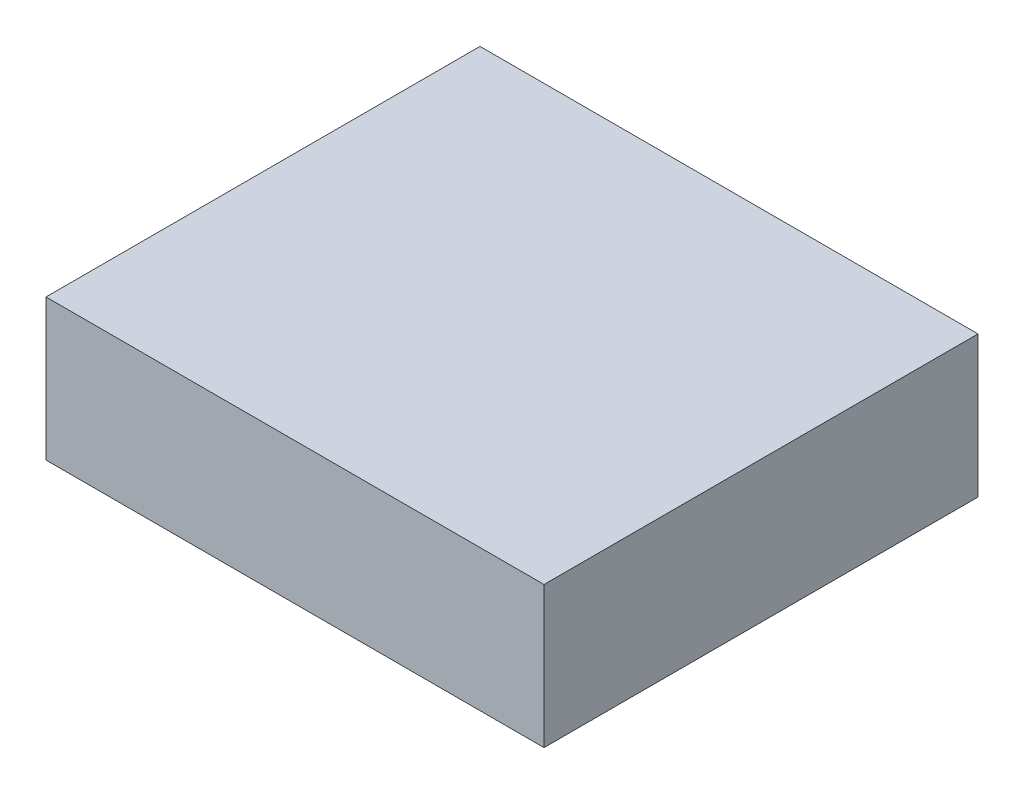
ISO-10303-21;
HEADER;
FILE_DESCRIPTION(('STEP AP214'),'2;1');
FILE_NAME('part.step','',(''),(''),'','','');
FILE_SCHEMA(('AUTOMOTIVE_DESIGN { 1 0 10303 214 1 1 1 1 }'));
ENDSEC;
DATA;
#1=APPLICATION_CONTEXT('core data for automotive mechanical design processes');
#2=APPLICATION_PROTOCOL_DEFINITION('international standard','automotive_design',2000,#1);
#3=PRODUCT_CONTEXT('',#1,'mechanical');
#4=PRODUCT('Part','Part','',(#3));
#5=PRODUCT_RELATED_PRODUCT_CATEGORY('part','',(#4));
#6=PRODUCT_DEFINITION_FORMATION('','',#4);
#7=PRODUCT_DEFINITION_CONTEXT('part definition',#1,'design');
#8=PRODUCT_DEFINITION('design','',#6,#7);
#9=PRODUCT_DEFINITION_SHAPE('','',#8);
#10=(LENGTH_UNIT() NAMED_UNIT(*) SI_UNIT(.MILLI.,.METRE.));
#11=(NAMED_UNIT(*) PLANE_ANGLE_UNIT() SI_UNIT($,.RADIAN.));
#12=(NAMED_UNIT(*) SI_UNIT($,.STERADIAN.) SOLID_ANGLE_UNIT());
#13=UNCERTAINTY_MEASURE_WITH_UNIT(LENGTH_MEASURE(1.E-05),#10,'distance_accuracy_value','');
#14=(GEOMETRIC_REPRESENTATION_CONTEXT(3) GLOBAL_UNCERTAINTY_ASSIGNED_CONTEXT((#13)) GLOBAL_UNIT_ASSIGNED_CONTEXT((#10,
#11,#12)) REPRESENTATION_CONTEXT('',''));
#15=CARTESIAN_POINT('',(0.,0.,0.));
#16=DIRECTION('',(0.,0.,1.));
#17=DIRECTION('',(1.,0.,0.));
#18=AXIS2_PLACEMENT_3D('',#15,#16,#17);
#19=CARTESIAN_POINT('',(5640.,-800.,4915.));
#20=DIRECTION('',(-1.,0.,0.));
#21=DIRECTION('',(0.,0.,1.));
#22=AXIS2_PLACEMENT_3D('',#19,#20,#21);
#23=PLANE('',#22);
#24=DIRECTION('',(0.,1.,0.));
#25=VECTOR('',#24,1.);
#26=CARTESIAN_POINT('',(5640.,-800.,-4915.));
#27=LINE('',#26,#25);
#28=CARTESIAN_POINT('',(5640.,-800.,-4915.));
#29=VERTEX_POINT('',#28);
#30=CARTESIAN_POINT('',(5640.,2400.,-4915.));
#31=VERTEX_POINT('',#30);
#32=EDGE_CURVE('E100',#29,#31,#27,.T.);
#33=ORIENTED_EDGE('',*,*,#32,.T.);
#34=DIRECTION('',(0.,0.,-1.));
#35=VECTOR('',#34,1.);
#36=CARTESIAN_POINT('',(5640.,2400.,4915.));
#37=LINE('',#36,#35);
#38=CARTESIAN_POINT('',(5640.,2400.,4915.));
#39=VERTEX_POINT('',#38);
#40=EDGE_CURVE('E11',#39,#31,#37,.T.);
#41=ORIENTED_EDGE('',*,*,#40,.F.);
#42=DIRECTION('',(0.,1.,0.));
#43=VECTOR('',#42,1.);
#44=CARTESIAN_POINT('',(5640.,-800.,4915.));
#45=LINE('',#44,#43);
#46=CARTESIAN_POINT('',(5640.,-800.,4915.));
#47=VERTEX_POINT('',#46);
#48=EDGE_CURVE('E88',#47,#39,#45,.T.);
#49=ORIENTED_EDGE('',*,*,#48,.F.);
#50=DIRECTION('',(0.,0.,-1.));
#51=VECTOR('',#50,1.);
#52=CARTESIAN_POINT('',(5640.,-800.,4915.));
#53=LINE('',#52,#51);
#54=EDGE_CURVE('E96',#47,#29,#53,.T.);
#55=ORIENTED_EDGE('',*,*,#54,.T.);
#56=EDGE_LOOP('',(#33,#41,#49,#55));
#57=FACE_BOUND('',#56,.T.);
#58=ADVANCED_FACE('F37',(#57),#23,.F.);
#59=CARTESIAN_POINT('',(-5640.,2400.,4915.));
#60=DIRECTION('',(0.,-1.,0.));
#61=DIRECTION('',(0.,0.,-1.));
#62=AXIS2_PLACEMENT_3D('',#59,#60,#61);
#63=PLANE('',#62);
#64=DIRECTION('',(-1.,0.,0.));
#65=VECTOR('',#64,1.);
#66=CARTESIAN_POINT('',(-5640.,2400.,-4915.));
#67=LINE('',#66,#65);
#68=CARTESIAN_POINT('',(-5640.,2400.,-4915.));
#69=VERTEX_POINT('',#68);
#70=EDGE_CURVE('E92',#31,#69,#67,.T.);
#71=ORIENTED_EDGE('',*,*,#70,.T.);
#72=DIRECTION('',(0.,0.,-1.));
#73=VECTOR('',#72,1.);
#74=CARTESIAN_POINT('',(-5640.,2400.,4915.));
#75=LINE('',#74,#73);
#76=CARTESIAN_POINT('',(-5640.,2400.,4915.));
#77=VERTEX_POINT('',#76);
#78=EDGE_CURVE('E45',#77,#69,#75,.T.);
#79=ORIENTED_EDGE('',*,*,#78,.F.);
#80=DIRECTION('',(-1.,0.,0.));
#81=VECTOR('',#80,1.);
#82=CARTESIAN_POINT('',(-5640.,2400.,4915.));
#83=LINE('',#82,#81);
#84=EDGE_CURVE('E83',#39,#77,#83,.T.);
#85=ORIENTED_EDGE('',*,*,#84,.F.);
#86=ORIENTED_EDGE('',*,*,#40,.T.);
#87=EDGE_LOOP('',(#71,#79,#85,#86));
#88=FACE_BOUND('',#87,.T.);
#89=ADVANCED_FACE('F91',(#88),#63,.F.);
#90=CARTESIAN_POINT('',(-5640.,-800.,4915.));
#91=DIRECTION('',(1.,0.,0.));
#92=DIRECTION('',(0.,0.,-1.));
#93=AXIS2_PLACEMENT_3D('',#90,#91,#92);
#94=PLANE('',#93);
#95=DIRECTION('',(0.,-1.,0.));
#96=VECTOR('',#95,1.);
#97=CARTESIAN_POINT('',(-5640.,-800.,-4915.));
#98=LINE('',#97,#96);
#99=CARTESIAN_POINT('',(-5640.,-800.,-4915.));
#100=VERTEX_POINT('',#99);
#101=EDGE_CURVE('E70',#69,#100,#98,.T.);
#102=ORIENTED_EDGE('',*,*,#101,.T.);
#103=DIRECTION('',(0.,0.,-1.));
#104=VECTOR('',#103,1.);
#105=CARTESIAN_POINT('',(-5640.,-800.,4915.));
#106=LINE('',#105,#104);
#107=CARTESIAN_POINT('',(-5640.,-800.,4915.));
#108=VERTEX_POINT('',#107);
#109=EDGE_CURVE('E93',#108,#100,#106,.T.);
#110=ORIENTED_EDGE('',*,*,#109,.F.);
#111=DIRECTION('',(0.,-1.,0.));
#112=VECTOR('',#111,1.);
#113=CARTESIAN_POINT('',(-5640.,-800.,4915.));
#114=LINE('',#113,#112);
#115=EDGE_CURVE('E86',#77,#108,#114,.T.);
#116=ORIENTED_EDGE('',*,*,#115,.F.);
#117=ORIENTED_EDGE('',*,*,#78,.T.);
#118=EDGE_LOOP('',(#102,#110,#116,#117));
#119=FACE_BOUND('',#118,.T.);
#120=ADVANCED_FACE('F94',(#119),#94,.F.);
#121=CARTESIAN_POINT('',(-5640.,-800.,4915.));
#122=DIRECTION('',(0.,1.,0.));
#123=DIRECTION('',(0.,0.,1.));
#124=AXIS2_PLACEMENT_3D('',#121,#122,#123);
#125=PLANE('',#124);
#126=DIRECTION('',(1.,0.,0.));
#127=VECTOR('',#126,1.);
#128=CARTESIAN_POINT('',(-5640.,-800.,-4915.));
#129=LINE('',#128,#127);
#130=EDGE_CURVE('E76',#100,#29,#129,.T.);
#131=ORIENTED_EDGE('',*,*,#130,.T.);
#132=ORIENTED_EDGE('',*,*,#54,.F.);
#133=DIRECTION('',(1.,0.,0.));
#134=VECTOR('',#133,1.);
#135=CARTESIAN_POINT('',(-5640.,-800.,4915.));
#136=LINE('',#135,#134);
#137=EDGE_CURVE('E53',#108,#47,#136,.T.);
#138=ORIENTED_EDGE('',*,*,#137,.F.);
#139=ORIENTED_EDGE('',*,*,#109,.T.);
#140=EDGE_LOOP('',(#131,#132,#138,#139));
#141=FACE_BOUND('',#140,.T.);
#142=ADVANCED_FACE('F107',(#141),#125,.F.);
#143=CARTESIAN_POINT('',(0.,0.,4915.));
#144=DIRECTION('',(0.,0.,-1.));
#145=DIRECTION('',(-1.,0.,0.));
#146=AXIS2_PLACEMENT_3D('',#143,#144,#145);
#147=PLANE('',#146);
#148=ORIENTED_EDGE('',*,*,#48,.T.);
#149=ORIENTED_EDGE('',*,*,#84,.T.);
#150=ORIENTED_EDGE('',*,*,#115,.T.);
#151=ORIENTED_EDGE('',*,*,#137,.T.);
#152=EDGE_LOOP('',(#148,#149,#150,#151));
#153=FACE_BOUND('',#152,.T.);
#154=ADVANCED_FACE('F84',(#153),#147,.F.);
#155=CARTESIAN_POINT('',(0.,0.,-4915.));
#156=DIRECTION('',(0.,0.,-1.));
#157=DIRECTION('',(-1.,0.,0.));
#158=AXIS2_PLACEMENT_3D('',#155,#156,#157);
#159=PLANE('',#158);
#160=ORIENTED_EDGE('',*,*,#32,.F.);
#161=ORIENTED_EDGE('',*,*,#130,.F.);
#162=ORIENTED_EDGE('',*,*,#101,.F.);
#163=ORIENTED_EDGE('',*,*,#70,.F.);
#164=EDGE_LOOP('',(#160,#161,#162,#163));
#165=FACE_BOUND('',#164,.T.);
#166=ADVANCED_FACE('F110',(#165),#159,.T.);
#167=CLOSED_SHELL('',(#58,#89,#120,#142,#154,#166));
#168=MANIFOLD_SOLID_BREP('B2',#167);
#169=ADVANCED_BREP_SHAPE_REPRESENTATION('',(#18,#168),#14);
#170=SHAPE_DEFINITION_REPRESENTATION(#9,#169);
ENDSEC;
END-ISO-10303-21;
